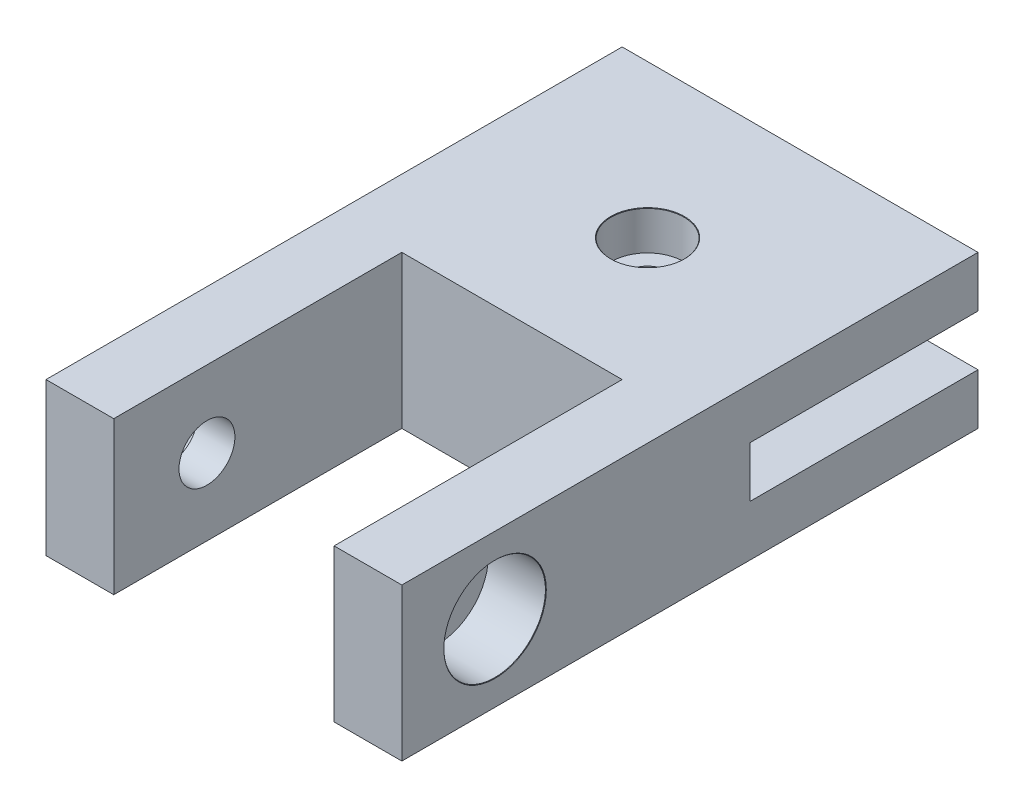
ISO-10303-21;
HEADER;
FILE_DESCRIPTION(('STEP AP214'),'2;1');
FILE_NAME('part.step','',(''),(''),'','','');
FILE_SCHEMA(('AUTOMOTIVE_DESIGN { 1 0 10303 214 1 1 1 1 }'));
ENDSEC;
DATA;
#1=APPLICATION_CONTEXT('core data for automotive mechanical design processes');
#2=APPLICATION_PROTOCOL_DEFINITION('international standard','automotive_design',2000,#1);
#3=PRODUCT_CONTEXT('',#1,'mechanical');
#4=PRODUCT('Part','Part','',(#3));
#5=PRODUCT_RELATED_PRODUCT_CATEGORY('part','',(#4));
#6=PRODUCT_DEFINITION_FORMATION('','',#4);
#7=PRODUCT_DEFINITION_CONTEXT('part definition',#1,'design');
#8=PRODUCT_DEFINITION('design','',#6,#7);
#9=PRODUCT_DEFINITION_SHAPE('','',#8);
#10=(LENGTH_UNIT() NAMED_UNIT(*) SI_UNIT(.MILLI.,.METRE.));
#11=(NAMED_UNIT(*) PLANE_ANGLE_UNIT() SI_UNIT($,.RADIAN.));
#12=(NAMED_UNIT(*) SI_UNIT($,.STERADIAN.) SOLID_ANGLE_UNIT());
#13=UNCERTAINTY_MEASURE_WITH_UNIT(LENGTH_MEASURE(1.E-05),#10,'distance_accuracy_value','');
#14=(GEOMETRIC_REPRESENTATION_CONTEXT(3) GLOBAL_UNCERTAINTY_ASSIGNED_CONTEXT((#13)) GLOBAL_UNIT_ASSIGNED_CONTEXT((#10,
#11,#12)) REPRESENTATION_CONTEXT('',''));
#15=CARTESIAN_POINT('',(0.,0.,0.));
#16=DIRECTION('',(0.,0.,1.));
#17=DIRECTION('',(1.,0.,0.));
#18=AXIS2_PLACEMENT_3D('',#15,#16,#17);
#19=CARTESIAN_POINT('',(0.,-0.00100000000000013,-8.00000000000001));
#20=DIRECTION('',(0.,1.,0.));
#21=DIRECTION('',(0.,0.,1.));
#22=AXIS2_PLACEMENT_3D('',#19,#20,#21);
#23=CYLINDRICAL_SURFACE('',#22,1.2);
#24=CARTESIAN_POINT('',(0.,3.,-8.00000000000001));
#25=DIRECTION('',(0.,1.,0.));
#26=DIRECTION('',(0.,0.,1.));
#27=AXIS2_PLACEMENT_3D('',#24,#25,#26);
#28=CIRCLE('',#27,1.2);
#29=CARTESIAN_POINT('',(0.,3.,-6.80000000000001));
#30=VERTEX_POINT('',#29);
#31=EDGE_CURVE('E278',#30,#30,#28,.T.);
#32=CARTESIAN_POINT('',(0.,1.8,-8.00000000000001));
#33=DIRECTION('',(0.,-1.,0.));
#34=DIRECTION('',(0.,0.,-1.));
#35=AXIS2_PLACEMENT_3D('',#32,#33,#34);
#36=CIRCLE('',#35,1.2);
#37=CARTESIAN_POINT('',(0.,1.8,-6.80000000000001));
#38=VERTEX_POINT('',#37);
#39=EDGE_CURVE('E46',#38,#38,#36,.F.);
#40=CARTESIAN_POINT('',(0.,3.,-6.80000000000001));
#41=CARTESIAN_POINT('',(0.,2.9875,-6.80000000000001));
#42=CARTESIAN_POINT('',(0.,2.975,-6.80000000000001));
#43=CARTESIAN_POINT('',(0.,2.95,-6.80000000000001));
#44=CARTESIAN_POINT('',(0.,2.9375,-6.80000000000001));
#45=CARTESIAN_POINT('',(0.,2.9125,-6.80000000000001));
#46=CARTESIAN_POINT('',(0.,2.9,-6.80000000000001));
#47=CARTESIAN_POINT('',(0.,2.875,-6.80000000000001));
#48=CARTESIAN_POINT('',(0.,2.8625,-6.80000000000001));
#49=CARTESIAN_POINT('',(0.,2.8375,-6.80000000000001));
#50=CARTESIAN_POINT('',(0.,2.825,-6.80000000000001));
#51=CARTESIAN_POINT('',(0.,2.8,-6.80000000000001));
#52=CARTESIAN_POINT('',(0.,2.7875,-6.80000000000001));
#53=CARTESIAN_POINT('',(0.,2.7625,-6.80000000000001));
#54=CARTESIAN_POINT('',(0.,2.75,-6.80000000000001));
#55=CARTESIAN_POINT('',(0.,2.725,-6.80000000000001));
#56=CARTESIAN_POINT('',(0.,2.7125,-6.80000000000001));
#57=CARTESIAN_POINT('',(0.,2.6875,-6.80000000000001));
#58=CARTESIAN_POINT('',(0.,2.675,-6.80000000000001));
#59=CARTESIAN_POINT('',(0.,2.65,-6.80000000000001));
#60=CARTESIAN_POINT('',(0.,2.6375,-6.80000000000001));
#61=CARTESIAN_POINT('',(0.,2.6125,-6.80000000000001));
#62=CARTESIAN_POINT('',(0.,2.6,-6.80000000000001));
#63=CARTESIAN_POINT('',(0.,2.575,-6.80000000000001));
#64=CARTESIAN_POINT('',(0.,2.5625,-6.80000000000001));
#65=CARTESIAN_POINT('',(0.,2.5375,-6.80000000000001));
#66=CARTESIAN_POINT('',(0.,2.525,-6.80000000000001));
#67=CARTESIAN_POINT('',(0.,2.5,-6.80000000000001));
#68=CARTESIAN_POINT('',(0.,2.4875,-6.80000000000001));
#69=CARTESIAN_POINT('',(0.,2.4625,-6.80000000000001));
#70=CARTESIAN_POINT('',(0.,2.45,-6.80000000000001));
#71=CARTESIAN_POINT('',(0.,2.425,-6.80000000000001));
#72=CARTESIAN_POINT('',(0.,2.4125,-6.80000000000001));
#73=CARTESIAN_POINT('',(0.,2.3875,-6.80000000000001));
#74=CARTESIAN_POINT('',(0.,2.375,-6.80000000000001));
#75=CARTESIAN_POINT('',(0.,2.35,-6.80000000000001));
#76=CARTESIAN_POINT('',(0.,2.3375,-6.80000000000001));
#77=CARTESIAN_POINT('',(0.,2.3125,-6.80000000000001));
#78=CARTESIAN_POINT('',(0.,2.3,-6.80000000000001));
#79=CARTESIAN_POINT('',(0.,2.275,-6.80000000000001));
#80=CARTESIAN_POINT('',(0.,2.2625,-6.80000000000001));
#81=CARTESIAN_POINT('',(0.,2.2375,-6.80000000000001));
#82=CARTESIAN_POINT('',(0.,2.225,-6.80000000000001));
#83=CARTESIAN_POINT('',(0.,2.2,-6.80000000000001));
#84=CARTESIAN_POINT('',(0.,2.1875,-6.80000000000001));
#85=CARTESIAN_POINT('',(0.,2.1625,-6.80000000000001));
#86=CARTESIAN_POINT('',(0.,2.15,-6.80000000000001));
#87=CARTESIAN_POINT('',(0.,2.125,-6.80000000000001));
#88=CARTESIAN_POINT('',(0.,2.1125,-6.80000000000001));
#89=CARTESIAN_POINT('',(0.,2.0875,-6.80000000000001));
#90=CARTESIAN_POINT('',(0.,2.075,-6.80000000000001));
#91=CARTESIAN_POINT('',(0.,2.05,-6.80000000000001));
#92=CARTESIAN_POINT('',(0.,2.0375,-6.80000000000001));
#93=CARTESIAN_POINT('',(0.,2.0125,-6.80000000000001));
#94=CARTESIAN_POINT('',(0.,2.,-6.80000000000001));
#95=CARTESIAN_POINT('',(0.,1.975,-6.80000000000001));
#96=CARTESIAN_POINT('',(0.,1.9625,-6.80000000000001));
#97=CARTESIAN_POINT('',(0.,1.9375,-6.80000000000001));
#98=CARTESIAN_POINT('',(0.,1.925,-6.80000000000001));
#99=CARTESIAN_POINT('',(0.,1.9,-6.80000000000001));
#100=CARTESIAN_POINT('',(0.,1.8875,-6.80000000000001));
#101=CARTESIAN_POINT('',(0.,1.8625,-6.80000000000001));
#102=CARTESIAN_POINT('',(0.,1.85,-6.80000000000001));
#103=CARTESIAN_POINT('',(0.,1.825,-6.80000000000001));
#104=CARTESIAN_POINT('',(0.,1.8125,-6.80000000000001));
#105=CARTESIAN_POINT('',(0.,1.8,-6.80000000000001));
#106=B_SPLINE_CURVE_WITH_KNOTS('',3,(#40,#41,#42,#43,#44,#45,#46,#47,#48,#49,#50,#51,#52,#53,
#54,#55,#56,#57,#58,#59,#60,#61,#62,#63,#64,#65,#66,#67,#68,#69,#70,#71,#72,#73,#74,#75,#76,#77,
#78,#79,#80,#81,#82,#83,#84,#85,#86,#87,#88,#89,#90,#91,#92,#93,#94,#95,#96,#97,#98,#99,#100,
#101,#102,#103,#104,#105),.UNSPECIFIED.,.F.,.F.,(4,2,2,2,2,2,2,2,2,2,2,2,2,2,2,2,2,2,2,2,2,2,2,
2,2,2,2,2,2,2,2,2,4),(0.,0.0375000000000002,0.075,0.1125,0.15,0.1875,0.225,0.2625,0.3,0.3375,
0.375,0.4125,0.45,0.4875,0.525,0.5625,0.6,0.6375,0.675,0.7125,0.75,0.7875,0.825,0.8625,0.9,
0.9375,0.975,1.0125,1.05,1.0875,1.125,1.1625,1.2),.UNSPECIFIED.);
#107=EDGE_CURVE('BSEAM42',#30,#38,#106,.T.);
#108=ORIENTED_EDGE('',*,*,#31,.T.);
#109=ORIENTED_EDGE('',*,*,#39,.F.);
#110=ORIENTED_EDGE('',*,*,#107,.T.);
#111=ORIENTED_EDGE('',*,*,#107,.F.);
#112=EDGE_LOOP('',(#108,#110,#109,#111));
#113=FACE_BOUND('',#112,.T.);
#114=ADVANCED_FACE('F42',(#113),#23,.F.);
#115=CARTESIAN_POINT('',(10.5,9.,-17.));
#116=DIRECTION('',(-1.,0.,0.));
#117=DIRECTION('',(0.,0.,1.));
#118=AXIS2_PLACEMENT_3D('',#115,#116,#117);
#119=PLANE('',#118);
#120=CARTESIAN_POINT('',(10.5,4.5,11.5));
#121=DIRECTION('',(1.,0.,0.));
#122=DIRECTION('',(0.,0.,-1.));
#123=AXIS2_PLACEMENT_3D('',#120,#121,#122);
#124=CIRCLE('',#123,3.025);
#125=CARTESIAN_POINT('',(10.5,4.5,8.47499999999999));
#126=VERTEX_POINT('',#125);
#127=EDGE_CURVE('E395',#126,#126,#124,.T.);
#128=ORIENTED_EDGE('',*,*,#127,.F.);
#129=EDGE_LOOP('',(#128));
#130=FACE_BOUND('',#129,.T.);
#131=DIRECTION('',(0.,0.,1.));
#132=VECTOR('',#131,1.);
#133=CARTESIAN_POINT('',(10.5,6.,-17.));
#134=LINE('',#133,#132);
#135=CARTESIAN_POINT('',(10.5,6.,-17.));
#136=VERTEX_POINT('',#135);
#137=CARTESIAN_POINT('',(10.5,6.,-3.55277781657247));
#138=VERTEX_POINT('',#137);
#139=EDGE_CURVE('E303',#136,#138,#134,.T.);
#140=ORIENTED_EDGE('',*,*,#139,.F.);
#141=DIRECTION('',(0.,-1.,0.));
#142=VECTOR('',#141,1.);
#143=CARTESIAN_POINT('',(10.5,9.,-17.));
#144=LINE('',#143,#142);
#145=CARTESIAN_POINT('',(10.5,9.,-17.));
#146=VERTEX_POINT('',#145);
#147=EDGE_CURVE('E11',#146,#136,#144,.T.);
#148=ORIENTED_EDGE('',*,*,#147,.F.);
#149=DIRECTION('',(0.,0.,-1.));
#150=VECTOR('',#149,1.);
#151=CARTESIAN_POINT('',(10.5,9.,-17.));
#152=LINE('',#151,#150);
#153=CARTESIAN_POINT('',(10.5,9.,17.));
#154=VERTEX_POINT('',#153);
#155=EDGE_CURVE('E467',#154,#146,#152,.T.);
#156=ORIENTED_EDGE('',*,*,#155,.F.);
#157=DIRECTION('',(0.,-1.,0.));
#158=VECTOR('',#157,1.);
#159=CARTESIAN_POINT('',(10.5,9.,17.));
#160=LINE('',#159,#158);
#161=CARTESIAN_POINT('',(10.5,0.,17.));
#162=VERTEX_POINT('',#161);
#163=EDGE_CURVE('E483',#154,#162,#160,.T.);
#164=ORIENTED_EDGE('',*,*,#163,.T.);
#165=DIRECTION('',(0.,0.,-1.));
#166=VECTOR('',#165,1.);
#167=CARTESIAN_POINT('',(10.5,0.,-17.));
#168=LINE('',#167,#166);
#169=CARTESIAN_POINT('',(10.5,0.,-17.));
#170=VERTEX_POINT('',#169);
#171=EDGE_CURVE('E457',#162,#170,#168,.T.);
#172=ORIENTED_EDGE('',*,*,#171,.T.);
#173=CARTESIAN_POINT('',(10.5,3.,-17.));
#174=VERTEX_POINT('',#173);
#175=EDGE_CURVE('E52',#174,#170,#144,.T.);
#176=ORIENTED_EDGE('',*,*,#175,.F.);
#177=DIRECTION('',(0.,0.,1.));
#178=VECTOR('',#177,1.);
#179=CARTESIAN_POINT('',(10.5,3.,-17.));
#180=LINE('',#179,#178);
#181=CARTESIAN_POINT('',(10.5,3.,-3.55277781657247));
#182=VERTEX_POINT('',#181);
#183=EDGE_CURVE('E302',#174,#182,#180,.T.);
#184=ORIENTED_EDGE('',*,*,#183,.T.);
#185=DIRECTION('',(0.,-1.,0.));
#186=VECTOR('',#185,1.);
#187=CARTESIAN_POINT('',(10.5,6.,-3.55277781657247));
#188=LINE('',#187,#186);
#189=EDGE_CURVE('E317',#138,#182,#188,.T.);
#190=ORIENTED_EDGE('',*,*,#189,.F.);
#191=EDGE_LOOP('',(#140,#148,#156,#164,#172,#176,#184,#190));
#192=FACE_BOUND('',#191,.T.);
#193=ADVANCED_FACE('F44',(#130,#192),#119,.F.);
#194=CARTESIAN_POINT('',(-10.5,9.,-17.));
#195=DIRECTION('',(0.,0.,1.));
#196=DIRECTION('',(1.,0.,0.));
#197=AXIS2_PLACEMENT_3D('',#194,#195,#196);
#198=PLANE('',#197);
#199=DIRECTION('',(1.,0.,0.));
#200=VECTOR('',#199,1.);
#201=CARTESIAN_POINT('',(10.5,6.,-17.));
#202=LINE('',#201,#200);
#203=CARTESIAN_POINT('',(-10.5,6.,-17.));
#204=VERTEX_POINT('',#203);
#205=EDGE_CURVE('E314',#204,#136,#202,.T.);
#206=ORIENTED_EDGE('',*,*,#205,.F.);
#207=DIRECTION('',(0.,-1.,0.));
#208=VECTOR('',#207,1.);
#209=CARTESIAN_POINT('',(-10.5,9.,-17.));
#210=LINE('',#209,#208);
#211=CARTESIAN_POINT('',(-10.5,9.,-17.));
#212=VERTEX_POINT('',#211);
#213=EDGE_CURVE('E506',#212,#204,#210,.T.);
#214=ORIENTED_EDGE('',*,*,#213,.F.);
#215=DIRECTION('',(-1.,0.,0.));
#216=VECTOR('',#215,1.);
#217=CARTESIAN_POINT('',(-10.5,9.,-17.));
#218=LINE('',#217,#216);
#219=EDGE_CURVE('E471',#146,#212,#218,.T.);
#220=ORIENTED_EDGE('',*,*,#219,.F.);
#221=ORIENTED_EDGE('',*,*,#147,.T.);
#222=EDGE_LOOP('',(#206,#214,#220,#221));
#223=FACE_BOUND('',#222,.T.);
#224=ADVANCED_FACE('F539',(#223),#198,.F.);
#225=CARTESIAN_POINT('',(-10.5,9.,-17.));
#226=DIRECTION('',(1.,0.,0.));
#227=DIRECTION('',(0.,0.,-1.));
#228=AXIS2_PLACEMENT_3D('',#225,#226,#227);
#229=PLANE('',#228);
#230=DIRECTION('',(0.,0.866025403784438,0.5));
#231=VECTOR('',#230,1.);
#232=CARTESIAN_POINT('',(-10.5,1.6,13.1743157806499));
#233=LINE('',#232,#231);
#234=CARTESIAN_POINT('',(-10.5,1.6,13.1743157806499));
#235=VERTEX_POINT('',#234);
#236=CARTESIAN_POINT('',(-10.5,4.5,14.8486315612998));
#237=VERTEX_POINT('',#236);
#238=EDGE_CURVE('E373',#235,#237,#233,.T.);
#239=ORIENTED_EDGE('',*,*,#238,.F.);
#240=DIRECTION('',(0.,0.,1.));
#241=VECTOR('',#240,1.);
#242=CARTESIAN_POINT('',(-10.5,1.6,9.82568421935008));
#243=LINE('',#242,#241);
#244=CARTESIAN_POINT('',(-10.5,1.6,9.82568421935008));
#245=VERTEX_POINT('',#244);
#246=EDGE_CURVE('E344',#245,#235,#243,.T.);
#247=ORIENTED_EDGE('',*,*,#246,.F.);
#248=DIRECTION('',(0.,-0.866025403784439,0.5));
#249=VECTOR('',#248,1.);
#250=CARTESIAN_POINT('',(-10.5,4.5,8.15136843870017));
#251=LINE('',#250,#249);
#252=CARTESIAN_POINT('',(-10.5,4.5,8.15136843870017));
#253=VERTEX_POINT('',#252);
#254=EDGE_CURVE('E350',#253,#245,#251,.T.);
#255=ORIENTED_EDGE('',*,*,#254,.F.);
#256=DIRECTION('',(0.,-0.866025403784438,-0.5));
#257=VECTOR('',#256,1.);
#258=CARTESIAN_POINT('',(-10.5,7.4,9.82568421935008));
#259=LINE('',#258,#257);
#260=CARTESIAN_POINT('',(-10.5,7.4,9.82568421935008));
#261=VERTEX_POINT('',#260);
#262=EDGE_CURVE('E385',#261,#253,#259,.T.);
#263=ORIENTED_EDGE('',*,*,#262,.F.);
#264=DIRECTION('',(0.,0.,-1.));
#265=VECTOR('',#264,1.);
#266=CARTESIAN_POINT('',(-10.5,7.4,13.1743157806499));
#267=LINE('',#266,#265);
#268=CARTESIAN_POINT('',(-10.5,7.4,13.1743157806499));
#269=VERTEX_POINT('',#268);
#270=EDGE_CURVE('E381',#269,#261,#267,.T.);
#271=ORIENTED_EDGE('',*,*,#270,.F.);
#272=DIRECTION('',(0.,0.866025403784439,-0.5));
#273=VECTOR('',#272,1.);
#274=CARTESIAN_POINT('',(-10.5,4.5,14.8486315612998));
#275=LINE('',#274,#273);
#276=EDGE_CURVE('E377',#237,#269,#275,.T.);
#277=ORIENTED_EDGE('',*,*,#276,.F.);
#278=EDGE_LOOP('',(#239,#247,#255,#263,#271,#277));
#279=FACE_BOUND('',#278,.T.);
#280=DIRECTION('',(0.,0.,-1.));
#281=VECTOR('',#280,1.);
#282=CARTESIAN_POINT('',(-10.5,6.,-17.));
#283=LINE('',#282,#281);
#284=CARTESIAN_POINT('',(-10.5,6.,-3.55277781657247));
#285=VERTEX_POINT('',#284);
#286=EDGE_CURVE('E311',#285,#204,#283,.T.);
#287=ORIENTED_EDGE('',*,*,#286,.F.);
#288=DIRECTION('',(0.,-1.,0.));
#289=VECTOR('',#288,1.);
#290=CARTESIAN_POINT('',(-10.5,6.,-3.55277781657247));
#291=LINE('',#290,#289);
#292=CARTESIAN_POINT('',(-10.5,3.,-3.55277781657247));
#293=VERTEX_POINT('',#292);
#294=EDGE_CURVE('E330',#285,#293,#291,.T.);
#295=ORIENTED_EDGE('',*,*,#294,.T.);
#296=DIRECTION('',(0.,0.,-1.));
#297=VECTOR('',#296,1.);
#298=CARTESIAN_POINT('',(-10.5,3.,-17.));
#299=LINE('',#298,#297);
#300=CARTESIAN_POINT('',(-10.5,3.,-17.));
#301=VERTEX_POINT('',#300);
#302=EDGE_CURVE('E325',#293,#301,#299,.T.);
#303=ORIENTED_EDGE('',*,*,#302,.T.);
#304=CARTESIAN_POINT('',(-10.5,0.,-17.));
#305=VERTEX_POINT('',#304);
#306=EDGE_CURVE('E505',#301,#305,#210,.T.);
#307=ORIENTED_EDGE('',*,*,#306,.T.);
#308=DIRECTION('',(0.,0.,1.));
#309=VECTOR('',#308,1.);
#310=CARTESIAN_POINT('',(-10.5,0.,-17.));
#311=LINE('',#310,#309);
#312=CARTESIAN_POINT('',(-10.5,0.,17.));
#313=VERTEX_POINT('',#312);
#314=EDGE_CURVE('E491',#305,#313,#311,.T.);
#315=ORIENTED_EDGE('',*,*,#314,.T.);
#316=DIRECTION('',(0.,-1.,0.));
#317=VECTOR('',#316,1.);
#318=CARTESIAN_POINT('',(-10.5,9.,17.));
#319=LINE('',#318,#317);
#320=CARTESIAN_POINT('',(-10.5,9.,17.));
#321=VERTEX_POINT('',#320);
#322=EDGE_CURVE('E501',#321,#313,#319,.T.);
#323=ORIENTED_EDGE('',*,*,#322,.F.);
#324=DIRECTION('',(0.,0.,1.));
#325=VECTOR('',#324,1.);
#326=CARTESIAN_POINT('',(-10.5,9.,-17.));
#327=LINE('',#326,#325);
#328=EDGE_CURVE('E475',#212,#321,#327,.T.);
#329=ORIENTED_EDGE('',*,*,#328,.F.);
#330=ORIENTED_EDGE('',*,*,#213,.T.);
#331=EDGE_LOOP('',(#287,#295,#303,#307,#315,#323,#329,#330));
#332=FACE_BOUND('',#331,.T.);
#333=ADVANCED_FACE('F516',(#279,#332),#229,.F.);
#334=CARTESIAN_POINT('',(-10.5,9.,17.));
#335=DIRECTION('',(0.,0.,-1.));
#336=DIRECTION('',(-1.,0.,0.));
#337=AXIS2_PLACEMENT_3D('',#334,#335,#336);
#338=PLANE('',#337);
#339=DIRECTION('',(1.,0.,0.));
#340=VECTOR('',#339,1.);
#341=CARTESIAN_POINT('',(-10.5,9.,17.));
#342=LINE('',#341,#340);
#343=CARTESIAN_POINT('',(6.50184802096263,9.,17.));
#344=VERTEX_POINT('',#343);
#345=EDGE_CURVE('E478',#344,#154,#342,.T.);
#346=ORIENTED_EDGE('',*,*,#345,.F.);
#347=DIRECTION('',(0.,1.,0.));
#348=VECTOR('',#347,1.);
#349=CARTESIAN_POINT('',(6.50184802096263,0.,17.));
#350=LINE('',#349,#348);
#351=CARTESIAN_POINT('',(6.50184802096263,0.,17.));
#352=VERTEX_POINT('',#351);
#353=EDGE_CURVE('E454',#352,#344,#350,.T.);
#354=ORIENTED_EDGE('',*,*,#353,.F.);
#355=DIRECTION('',(1.,0.,0.));
#356=VECTOR('',#355,1.);
#357=CARTESIAN_POINT('',(-10.5,0.,17.));
#358=LINE('',#357,#356);
#359=EDGE_CURVE('E494',#352,#162,#358,.T.);
#360=ORIENTED_EDGE('',*,*,#359,.T.);
#361=ORIENTED_EDGE('',*,*,#163,.F.);
#362=EDGE_LOOP('',(#346,#354,#360,#361));
#363=FACE_BOUND('',#362,.T.);
#364=ADVANCED_FACE('F660',(#363),#338,.F.);
#365=ORIENTED_EDGE('',*,*,#306,.F.);
#366=DIRECTION('',(1.,0.,0.));
#367=VECTOR('',#366,1.);
#368=CARTESIAN_POINT('',(10.5,3.,-17.));
#369=LINE('',#368,#367);
#370=EDGE_CURVE('E67',#301,#174,#369,.T.);
#371=ORIENTED_EDGE('',*,*,#370,.T.);
#372=ORIENTED_EDGE('',*,*,#175,.T.);
#373=DIRECTION('',(-1.,0.,0.));
#374=VECTOR('',#373,1.);
#375=CARTESIAN_POINT('',(-10.5,0.,-17.));
#376=LINE('',#375,#374);
#377=EDGE_CURVE('E487',#170,#305,#376,.T.);
#378=ORIENTED_EDGE('',*,*,#377,.T.);
#379=EDGE_LOOP('',(#365,#371,#372,#378));
#380=FACE_BOUND('',#379,.T.);
#381=ADVANCED_FACE('F521',(#380),#198,.F.);
#382=CARTESIAN_POINT('',(-6.50184802096263,0.,17.));
#383=VERTEX_POINT('',#382);
#384=EDGE_CURVE('E472',#313,#383,#358,.T.);
#385=ORIENTED_EDGE('',*,*,#384,.T.);
#386=DIRECTION('',(0.,1.,0.));
#387=VECTOR('',#386,1.);
#388=CARTESIAN_POINT('',(-6.50184802096263,0.,17.));
#389=LINE('',#388,#387);
#390=CARTESIAN_POINT('',(-6.50184802096263,9.,17.));
#391=VERTEX_POINT('',#390);
#392=EDGE_CURVE('E458',#383,#391,#389,.T.);
#393=ORIENTED_EDGE('',*,*,#392,.T.);
#394=EDGE_CURVE('E479',#321,#391,#342,.T.);
#395=ORIENTED_EDGE('',*,*,#394,.F.);
#396=ORIENTED_EDGE('',*,*,#322,.T.);
#397=EDGE_LOOP('',(#385,#393,#395,#396));
#398=FACE_BOUND('',#397,.T.);
#399=ADVANCED_FACE('F529',(#398),#338,.F.);
#400=CARTESIAN_POINT('',(0.,9.,0.));
#401=DIRECTION('',(0.,1.,0.));
#402=DIRECTION('',(0.,0.,1.));
#403=AXIS2_PLACEMENT_3D('',#400,#401,#402);
#404=PLANE('',#403);
#405=CARTESIAN_POINT('',(0.,9.,-8.00000000000001));
#406=DIRECTION('',(0.,1.,0.));
#407=DIRECTION('',(0.,0.,1.));
#408=AXIS2_PLACEMENT_3D('',#405,#406,#407);
#409=CIRCLE('',#408,2.175);
#410=CARTESIAN_POINT('',(0.,9.,-5.82500000000001));
#411=VERTEX_POINT('',#410);
#412=EDGE_CURVE('E282',#411,#411,#409,.T.);
#413=ORIENTED_EDGE('',*,*,#412,.F.);
#414=EDGE_LOOP('',(#413));
#415=FACE_BOUND('',#414,.T.);
#416=DIRECTION('',(0.,0.,-1.));
#417=VECTOR('',#416,1.);
#418=CARTESIAN_POINT('',(6.50184802096263,9.,0.));
#419=LINE('',#418,#417);
#420=CARTESIAN_POINT('',(6.50184802096263,9.,0.));
#421=VERTEX_POINT('',#420);
#422=EDGE_CURVE('E430',#344,#421,#419,.T.);
#423=ORIENTED_EDGE('',*,*,#422,.F.);
#424=ORIENTED_EDGE('',*,*,#345,.T.);
#425=ORIENTED_EDGE('',*,*,#155,.T.);
#426=ORIENTED_EDGE('',*,*,#219,.T.);
#427=ORIENTED_EDGE('',*,*,#328,.T.);
#428=ORIENTED_EDGE('',*,*,#394,.T.);
#429=DIRECTION('',(0.,0.,1.));
#430=VECTOR('',#429,1.);
#431=CARTESIAN_POINT('',(-6.50184802096263,9.,0.));
#432=LINE('',#431,#430);
#433=CARTESIAN_POINT('',(-6.50184802096263,9.,0.));
#434=VERTEX_POINT('',#433);
#435=EDGE_CURVE('E436',#434,#391,#432,.T.);
#436=ORIENTED_EDGE('',*,*,#435,.F.);
#437=DIRECTION('',(-1.,0.,0.));
#438=VECTOR('',#437,1.);
#439=CARTESIAN_POINT('',(6.50184802096263,9.,0.));
#440=LINE('',#439,#438);
#441=EDGE_CURVE('E448',#421,#434,#440,.T.);
#442=ORIENTED_EDGE('',*,*,#441,.F.);
#443=EDGE_LOOP('',(#423,#424,#425,#426,#427,#428,#436,#442));
#444=FACE_BOUND('',#443,.T.);
#445=ADVANCED_FACE('F533',(#415,#444),#404,.T.);
#446=CARTESIAN_POINT('',(0.,0.,0.));
#447=DIRECTION('',(0.,1.,0.));
#448=DIRECTION('',(0.,0.,1.));
#449=AXIS2_PLACEMENT_3D('',#446,#447,#448);
#450=PLANE('',#449);
#451=DIRECTION('',(0.5,0.,0.866025403784438));
#452=VECTOR('',#451,1.);
#453=CARTESIAN_POINT('',(1.21243556529823,0.,-10.1));
#454=LINE('',#453,#452);
#455=CARTESIAN_POINT('',(1.21243556529823,0.,-10.1));
#456=VERTEX_POINT('',#455);
#457=CARTESIAN_POINT('',(2.42487113059644,0.,-8.00000000000001));
#458=VERTEX_POINT('',#457);
#459=EDGE_CURVE('E250',#456,#458,#454,.T.);
#460=ORIENTED_EDGE('',*,*,#459,.F.);
#461=DIRECTION('',(1.,0.,0.));
#462=VECTOR('',#461,1.);
#463=CARTESIAN_POINT('',(-1.21243556529821,0.,-10.1));
#464=LINE('',#463,#462);
#465=CARTESIAN_POINT('',(-1.21243556529821,0.,-10.1));
#466=VERTEX_POINT('',#465);
#467=EDGE_CURVE('E59',#466,#456,#464,.T.);
#468=ORIENTED_EDGE('',*,*,#467,.F.);
#469=DIRECTION('',(0.5,0.,-0.866025403784439));
#470=VECTOR('',#469,1.);
#471=CARTESIAN_POINT('',(-2.42487113059642,0.,-8.00000000000001));
#472=LINE('',#471,#470);
#473=CARTESIAN_POINT('',(-2.42487113059642,0.,-8.00000000000001));
#474=VERTEX_POINT('',#473);
#475=EDGE_CURVE('E230',#474,#466,#472,.T.);
#476=ORIENTED_EDGE('',*,*,#475,.F.);
#477=DIRECTION('',(-0.5,0.,-0.866025403784439));
#478=VECTOR('',#477,1.);
#479=CARTESIAN_POINT('',(-1.21243556529821,0.,-5.90000000000001));
#480=LINE('',#479,#478);
#481=CARTESIAN_POINT('',(-1.21243556529821,0.,-5.90000000000001));
#482=VERTEX_POINT('',#481);
#483=EDGE_CURVE('E234',#482,#474,#480,.T.);
#484=ORIENTED_EDGE('',*,*,#483,.F.);
#485=DIRECTION('',(-1.,0.,0.));
#486=VECTOR('',#485,1.);
#487=CARTESIAN_POINT('',(1.21243556529823,0.,-5.90000000000001));
#488=LINE('',#487,#486);
#489=CARTESIAN_POINT('',(1.21243556529823,0.,-5.90000000000001));
#490=VERTEX_POINT('',#489);
#491=EDGE_CURVE('E257',#490,#482,#488,.T.);
#492=ORIENTED_EDGE('',*,*,#491,.F.);
#493=DIRECTION('',(-0.5,0.,0.866025403784438));
#494=VECTOR('',#493,1.);
#495=CARTESIAN_POINT('',(2.42487113059644,0.,-8.00000000000001));
#496=LINE('',#495,#494);
#497=EDGE_CURVE('E253',#458,#490,#496,.T.);
#498=ORIENTED_EDGE('',*,*,#497,.F.);
#499=EDGE_LOOP('',(#460,#468,#476,#484,#492,#498));
#500=FACE_BOUND('',#499,.T.);
#501=ORIENTED_EDGE('',*,*,#359,.F.);
#502=DIRECTION('',(0.,0.,-1.));
#503=VECTOR('',#502,1.);
#504=CARTESIAN_POINT('',(6.50184802096263,0.,0.));
#505=LINE('',#504,#503);
#506=CARTESIAN_POINT('',(6.50184802096263,0.,0.));
#507=VERTEX_POINT('',#506);
#508=EDGE_CURVE('E431',#352,#507,#505,.T.);
#509=ORIENTED_EDGE('',*,*,#508,.T.);
#510=DIRECTION('',(-1.,0.,0.));
#511=VECTOR('',#510,1.);
#512=CARTESIAN_POINT('',(6.50184802096263,0.,0.));
#513=LINE('',#512,#511);
#514=CARTESIAN_POINT('',(-6.50184802096263,0.,0.));
#515=VERTEX_POINT('',#514);
#516=EDGE_CURVE('E435',#507,#515,#513,.T.);
#517=ORIENTED_EDGE('',*,*,#516,.T.);
#518=DIRECTION('',(0.,0.,1.));
#519=VECTOR('',#518,1.);
#520=CARTESIAN_POINT('',(-6.50184802096263,0.,0.));
#521=LINE('',#520,#519);
#522=EDGE_CURVE('E440',#515,#383,#521,.T.);
#523=ORIENTED_EDGE('',*,*,#522,.T.);
#524=ORIENTED_EDGE('',*,*,#384,.F.);
#525=ORIENTED_EDGE('',*,*,#314,.F.);
#526=ORIENTED_EDGE('',*,*,#377,.F.);
#527=ORIENTED_EDGE('',*,*,#171,.F.);
#528=EDGE_LOOP('',(#501,#509,#517,#523,#524,#525,#526,#527));
#529=FACE_BOUND('',#528,.T.);
#530=ADVANCED_FACE('F527',(#500,#529),#450,.F.);
#531=CARTESIAN_POINT('',(6.50184802096263,0.,0.));
#532=DIRECTION('',(1.,0.,0.));
#533=DIRECTION('',(0.,0.,-1.));
#534=AXIS2_PLACEMENT_3D('',#531,#532,#533);
#535=PLANE('',#534);
#536=CARTESIAN_POINT('',(6.50184802096263,4.5,11.5));
#537=DIRECTION('',(1.,0.,0.));
#538=DIRECTION('',(0.,0.,-1.));
#539=AXIS2_PLACEMENT_3D('',#536,#537,#538);
#540=CIRCLE('',#539,1.7);
#541=CARTESIAN_POINT('',(6.50184802096263,4.5,9.79999999999999));
#542=VERTEX_POINT('',#541);
#543=EDGE_CURVE('E426',#542,#542,#540,.T.);
#544=ORIENTED_EDGE('',*,*,#543,.T.);
#545=EDGE_LOOP('',(#544));
#546=FACE_BOUND('',#545,.T.);
#547=ORIENTED_EDGE('',*,*,#422,.T.);
#548=DIRECTION('',(0.,1.,0.));
#549=VECTOR('',#548,1.);
#550=CARTESIAN_POINT('',(6.50184802096263,0.,0.));
#551=LINE('',#550,#549);
#552=EDGE_CURVE('E444',#507,#421,#551,.T.);
#553=ORIENTED_EDGE('',*,*,#552,.F.);
#554=ORIENTED_EDGE('',*,*,#508,.F.);
#555=ORIENTED_EDGE('',*,*,#353,.T.);
#556=EDGE_LOOP('',(#547,#553,#554,#555));
#557=FACE_BOUND('',#556,.T.);
#558=ADVANCED_FACE('F645',(#546,#557),#535,.F.);
#559=CARTESIAN_POINT('',(-6.50184802096263,0.,0.));
#560=DIRECTION('',(-1.,0.,0.));
#561=DIRECTION('',(0.,0.,1.));
#562=AXIS2_PLACEMENT_3D('',#559,#560,#561);
#563=PLANE('',#562);
#564=CARTESIAN_POINT('',(-6.50184802096263,4.5,11.5));
#565=DIRECTION('',(-1.,0.,0.));
#566=DIRECTION('',(0.,0.,1.));
#567=AXIS2_PLACEMENT_3D('',#564,#565,#566);
#568=CIRCLE('',#567,1.65);
#569=CARTESIAN_POINT('',(-6.50184802096263,4.5,13.15));
#570=VERTEX_POINT('',#569);
#571=EDGE_CURVE('E340',#570,#570,#568,.F.);
#572=ORIENTED_EDGE('',*,*,#571,.F.);
#573=EDGE_LOOP('',(#572));
#574=FACE_BOUND('',#573,.T.);
#575=ORIENTED_EDGE('',*,*,#435,.T.);
#576=ORIENTED_EDGE('',*,*,#392,.F.);
#577=ORIENTED_EDGE('',*,*,#522,.F.);
#578=DIRECTION('',(0.,1.,0.));
#579=VECTOR('',#578,1.);
#580=CARTESIAN_POINT('',(-6.50184802096263,0.,0.));
#581=LINE('',#580,#579);
#582=EDGE_CURVE('E462',#515,#434,#581,.T.);
#583=ORIENTED_EDGE('',*,*,#582,.T.);
#584=EDGE_LOOP('',(#575,#576,#577,#583));
#585=FACE_BOUND('',#584,.T.);
#586=ADVANCED_FACE('F642',(#574,#585),#563,.F.);
#587=CARTESIAN_POINT('',(6.50184802096263,0.,0.));
#588=DIRECTION('',(0.,0.,-1.));
#589=DIRECTION('',(-1.,0.,0.));
#590=AXIS2_PLACEMENT_3D('',#587,#588,#589);
#591=PLANE('',#590);
#592=ORIENTED_EDGE('',*,*,#441,.T.);
#593=ORIENTED_EDGE('',*,*,#582,.F.);
#594=ORIENTED_EDGE('',*,*,#516,.F.);
#595=ORIENTED_EDGE('',*,*,#552,.T.);
#596=EDGE_LOOP('',(#592,#593,#594,#595));
#597=FACE_BOUND('',#596,.T.);
#598=ADVANCED_FACE('F640',(#597),#591,.F.);
#599=CARTESIAN_POINT('',(10.5,4.5,11.5));
#600=DIRECTION('',(1.,0.,0.));
#601=DIRECTION('',(0.,0.,-1.));
#602=AXIS2_PLACEMENT_3D('',#599,#600,#601);
#603=CYLINDRICAL_SURFACE('',#602,1.7);
#604=ORIENTED_EDGE('',*,*,#543,.F.);
#605=EDGE_LOOP('',(#604));
#606=FACE_BOUND('',#605,.T.);
#607=CARTESIAN_POINT('',(7.1,4.5,11.5));
#608=DIRECTION('',(1.,0.,0.));
#609=DIRECTION('',(0.,0.,-1.));
#610=AXIS2_PLACEMENT_3D('',#607,#608,#609);
#611=CIRCLE('',#610,1.7);
#612=CARTESIAN_POINT('',(7.1,4.5,9.79999999999999));
#613=VERTEX_POINT('',#612);
#614=EDGE_CURVE('E422',#613,#613,#611,.T.);
#615=ORIENTED_EDGE('',*,*,#614,.T.);
#616=EDGE_LOOP('',(#615));
#617=FACE_BOUND('',#616,.T.);
#618=ADVANCED_FACE('F636',(#606,#617),#603,.F.);
#619=CARTESIAN_POINT('',(7.1,7.5,11.5));
#620=DIRECTION('',(-1.,0.,0.));
#621=DIRECTION('',(0.,0.,1.));
#622=AXIS2_PLACEMENT_3D('',#619,#620,#621);
#623=PLANE('',#622);
#624=ORIENTED_EDGE('',*,*,#614,.F.);
#625=EDGE_LOOP('',(#624));
#626=FACE_BOUND('',#625,.T.);
#627=CARTESIAN_POINT('',(7.1,4.5,11.5));
#628=DIRECTION('',(1.,0.,0.));
#629=DIRECTION('',(0.,0.,-1.));
#630=AXIS2_PLACEMENT_3D('',#627,#628,#629);
#631=CIRCLE('',#630,3.);
#632=CARTESIAN_POINT('',(7.1,4.5,8.49999999999999));
#633=VERTEX_POINT('',#632);
#634=EDGE_CURVE('E418',#633,#633,#631,.T.);
#635=ORIENTED_EDGE('',*,*,#634,.T.);
#636=EDGE_LOOP('',(#635));
#637=FACE_BOUND('',#636,.T.);
#638=ADVANCED_FACE('F632',(#626,#637),#623,.F.);
#639=CARTESIAN_POINT('',(10.5,4.5,11.5));
#640=DIRECTION('',(1.,0.,0.));
#641=DIRECTION('',(0.,0.,-1.));
#642=AXIS2_PLACEMENT_3D('',#639,#640,#641);
#643=CYLINDRICAL_SURFACE('',#642,3.);
#644=ORIENTED_EDGE('',*,*,#634,.F.);
#645=EDGE_LOOP('',(#644));
#646=FACE_BOUND('',#645,.T.);
#647=CARTESIAN_POINT('',(10.475,4.5,11.5));
#648=DIRECTION('',(1.,0.,0.));
#649=DIRECTION('',(0.,0.,-1.));
#650=AXIS2_PLACEMENT_3D('',#647,#648,#649);
#651=CIRCLE('',#650,3.);
#652=CARTESIAN_POINT('',(10.475,4.5,8.49999999999999));
#653=VERTEX_POINT('',#652);
#654=EDGE_CURVE('E414',#653,#653,#651,.T.);
#655=ORIENTED_EDGE('',*,*,#654,.T.);
#656=EDGE_LOOP('',(#655));
#657=FACE_BOUND('',#656,.T.);
#658=ADVANCED_FACE('F628',(#646,#657),#643,.F.);
#659=CARTESIAN_POINT('',(10.5,4.5,11.5));
#660=DIRECTION('',(1.,0.,0.));
#661=DIRECTION('',(0.,0.,-1.));
#662=AXIS2_PLACEMENT_3D('',#659,#660,#661);
#663=CONICAL_SURFACE('',#662,3.025,0.785398163397448);
#664=ORIENTED_EDGE('',*,*,#654,.F.);
#665=EDGE_LOOP('',(#664));
#666=FACE_BOUND('',#665,.T.);
#667=ORIENTED_EDGE('',*,*,#127,.T.);
#668=EDGE_LOOP('',(#667));
#669=FACE_BOUND('',#668,.T.);
#670=ADVANCED_FACE('F624',(#666,#669),#663,.F.);
#671=CARTESIAN_POINT('',(-8.7,1.6,9.82568421935008));
#672=DIRECTION('',(0.,-1.,0.));
#673=DIRECTION('',(0.,0.,-1.));
#674=AXIS2_PLACEMENT_3D('',#671,#672,#673);
#675=PLANE('',#674);
#676=ORIENTED_EDGE('',*,*,#246,.T.);
#677=DIRECTION('',(-1.,0.,0.));
#678=VECTOR('',#677,1.);
#679=CARTESIAN_POINT('',(-8.7,1.6,13.1743157806499));
#680=LINE('',#679,#678);
#681=CARTESIAN_POINT('',(-8.7,1.6,13.1743157806499));
#682=VERTEX_POINT('',#681);
#683=EDGE_CURVE('E370',#682,#235,#680,.T.);
#684=ORIENTED_EDGE('',*,*,#683,.F.);
#685=DIRECTION('',(0.,0.,1.));
#686=VECTOR('',#685,1.);
#687=CARTESIAN_POINT('',(-8.7,1.6,9.82568421935008));
#688=LINE('',#687,#686);
#689=CARTESIAN_POINT('',(-8.7,1.6,9.82568421935008));
#690=VERTEX_POINT('',#689);
#691=EDGE_CURVE('E345',#690,#682,#688,.T.);
#692=ORIENTED_EDGE('',*,*,#691,.F.);
#693=DIRECTION('',(-1.,0.,0.));
#694=VECTOR('',#693,1.);
#695=CARTESIAN_POINT('',(-8.7,1.6,9.82568421935008));
#696=LINE('',#695,#694);
#697=EDGE_CURVE('E392',#690,#245,#696,.T.);
#698=ORIENTED_EDGE('',*,*,#697,.T.);
#699=EDGE_LOOP('',(#676,#684,#692,#698));
#700=FACE_BOUND('',#699,.T.);
#701=ADVANCED_FACE('F606',(#700),#675,.F.);
#702=CARTESIAN_POINT('',(-8.7,4.5,8.15136843870017));
#703=DIRECTION('',(0.,-0.5,-0.866025403784439));
#704=DIRECTION('',(0.,0.866025403784439,-0.5));
#705=AXIS2_PLACEMENT_3D('',#702,#703,#704);
#706=PLANE('',#705);
#707=ORIENTED_EDGE('',*,*,#254,.T.);
#708=ORIENTED_EDGE('',*,*,#697,.F.);
#709=DIRECTION('',(0.,-0.866025403784439,0.5));
#710=VECTOR('',#709,1.);
#711=CARTESIAN_POINT('',(-8.7,4.5,8.15136843870017));
#712=LINE('',#711,#710);
#713=CARTESIAN_POINT('',(-8.7,4.5,8.15136843870017));
#714=VERTEX_POINT('',#713);
#715=EDGE_CURVE('E366',#714,#690,#712,.T.);
#716=ORIENTED_EDGE('',*,*,#715,.F.);
#717=DIRECTION('',(-1.,0.,0.));
#718=VECTOR('',#717,1.);
#719=CARTESIAN_POINT('',(-8.7,4.5,8.15136843870017));
#720=LINE('',#719,#718);
#721=EDGE_CURVE('E396',#714,#253,#720,.T.);
#722=ORIENTED_EDGE('',*,*,#721,.T.);
#723=EDGE_LOOP('',(#707,#708,#716,#722));
#724=FACE_BOUND('',#723,.T.);
#725=ADVANCED_FACE('F602',(#724),#706,.F.);
#726=CARTESIAN_POINT('',(-8.7,7.4,9.82568421935008));
#727=DIRECTION('',(0.,0.5,-0.866025403784438));
#728=DIRECTION('',(0.,0.866025403784439,0.5));
#729=AXIS2_PLACEMENT_3D('',#726,#727,#728);
#730=PLANE('',#729);
#731=ORIENTED_EDGE('',*,*,#262,.T.);
#732=ORIENTED_EDGE('',*,*,#721,.F.);
#733=DIRECTION('',(0.,-0.866025403784438,-0.5));
#734=VECTOR('',#733,1.);
#735=CARTESIAN_POINT('',(-8.7,7.4,9.82568421935008));
#736=LINE('',#735,#734);
#737=CARTESIAN_POINT('',(-8.7,7.4,9.82568421935008));
#738=VERTEX_POINT('',#737);
#739=EDGE_CURVE('E362',#738,#714,#736,.T.);
#740=ORIENTED_EDGE('',*,*,#739,.F.);
#741=DIRECTION('',(-1.,0.,0.));
#742=VECTOR('',#741,1.);
#743=CARTESIAN_POINT('',(-8.7,7.4,9.82568421935008));
#744=LINE('',#743,#742);
#745=EDGE_CURVE('E399',#738,#261,#744,.T.);
#746=ORIENTED_EDGE('',*,*,#745,.T.);
#747=EDGE_LOOP('',(#731,#732,#740,#746));
#748=FACE_BOUND('',#747,.T.);
#749=ADVANCED_FACE('F605',(#748),#730,.F.);
#750=CARTESIAN_POINT('',(-8.7,7.4,13.1743157806499));
#751=DIRECTION('',(0.,1.,0.));
#752=DIRECTION('',(0.,0.,1.));
#753=AXIS2_PLACEMENT_3D('',#750,#751,#752);
#754=PLANE('',#753);
#755=ORIENTED_EDGE('',*,*,#270,.T.);
#756=ORIENTED_EDGE('',*,*,#745,.F.);
#757=DIRECTION('',(0.,0.,-1.));
#758=VECTOR('',#757,1.);
#759=CARTESIAN_POINT('',(-8.7,7.4,13.1743157806499));
#760=LINE('',#759,#758);
#761=CARTESIAN_POINT('',(-8.7,7.4,13.1743157806499));
#762=VERTEX_POINT('',#761);
#763=EDGE_CURVE('E358',#762,#738,#760,.T.);
#764=ORIENTED_EDGE('',*,*,#763,.F.);
#765=DIRECTION('',(-1.,0.,0.));
#766=VECTOR('',#765,1.);
#767=CARTESIAN_POINT('',(-8.7,7.4,13.1743157806499));
#768=LINE('',#767,#766);
#769=EDGE_CURVE('E402',#762,#269,#768,.T.);
#770=ORIENTED_EDGE('',*,*,#769,.T.);
#771=EDGE_LOOP('',(#755,#756,#764,#770));
#772=FACE_BOUND('',#771,.T.);
#773=ADVANCED_FACE('F610',(#772),#754,.F.);
#774=CARTESIAN_POINT('',(-8.7,4.5,14.8486315612998));
#775=DIRECTION('',(0.,0.5,0.866025403784439));
#776=DIRECTION('',(0.,-0.866025403784439,0.5));
#777=AXIS2_PLACEMENT_3D('',#774,#775,#776);
#778=PLANE('',#777);
#779=ORIENTED_EDGE('',*,*,#276,.T.);
#780=ORIENTED_EDGE('',*,*,#769,.F.);
#781=DIRECTION('',(0.,0.866025403784439,-0.5));
#782=VECTOR('',#781,1.);
#783=CARTESIAN_POINT('',(-8.7,4.5,14.8486315612998));
#784=LINE('',#783,#782);
#785=CARTESIAN_POINT('',(-8.7,4.5,14.8486315612998));
#786=VERTEX_POINT('',#785);
#787=EDGE_CURVE('E354',#786,#762,#784,.T.);
#788=ORIENTED_EDGE('',*,*,#787,.F.);
#789=DIRECTION('',(-1.,0.,0.));
#790=VECTOR('',#789,1.);
#791=CARTESIAN_POINT('',(-8.7,4.5,14.8486315612998));
#792=LINE('',#791,#790);
#793=EDGE_CURVE('E405',#786,#237,#792,.T.);
#794=ORIENTED_EDGE('',*,*,#793,.T.);
#795=EDGE_LOOP('',(#779,#780,#788,#794));
#796=FACE_BOUND('',#795,.T.);
#797=ADVANCED_FACE('F614',(#796),#778,.F.);
#798=CARTESIAN_POINT('',(-8.7,1.6,13.1743157806499));
#799=DIRECTION('',(0.,-0.5,0.866025403784438));
#800=DIRECTION('',(0.,-0.866025403784439,-0.5));
#801=AXIS2_PLACEMENT_3D('',#798,#799,#800);
#802=PLANE('',#801);
#803=ORIENTED_EDGE('',*,*,#238,.T.);
#804=ORIENTED_EDGE('',*,*,#793,.F.);
#805=DIRECTION('',(0.,0.866025403784438,0.5));
#806=VECTOR('',#805,1.);
#807=CARTESIAN_POINT('',(-8.7,1.6,13.1743157806499));
#808=LINE('',#807,#806);
#809=EDGE_CURVE('E349',#682,#786,#808,.T.);
#810=ORIENTED_EDGE('',*,*,#809,.F.);
#811=ORIENTED_EDGE('',*,*,#683,.T.);
#812=EDGE_LOOP('',(#803,#804,#810,#811));
#813=FACE_BOUND('',#812,.T.);
#814=ADVANCED_FACE('F600',(#813),#802,.F.);
#815=CARTESIAN_POINT('',(-8.7,0.,0.));
#816=DIRECTION('',(-1.,0.,0.));
#817=DIRECTION('',(0.,0.,1.));
#818=AXIS2_PLACEMENT_3D('',#815,#816,#817);
#819=PLANE('',#818);
#820=CARTESIAN_POINT('',(-8.7,4.5,11.5));
#821=DIRECTION('',(-1.,0.,0.));
#822=DIRECTION('',(0.,0.,1.));
#823=AXIS2_PLACEMENT_3D('',#820,#821,#822);
#824=CIRCLE('',#823,1.65);
#825=CARTESIAN_POINT('',(-8.7,4.5,13.15));
#826=VERTEX_POINT('',#825);
#827=EDGE_CURVE('E334',#826,#826,#824,.T.);
#828=ORIENTED_EDGE('',*,*,#827,.F.);
#829=EDGE_LOOP('',(#828));
#830=FACE_BOUND('',#829,.T.);
#831=ORIENTED_EDGE('',*,*,#691,.T.);
#832=ORIENTED_EDGE('',*,*,#809,.T.);
#833=ORIENTED_EDGE('',*,*,#787,.T.);
#834=ORIENTED_EDGE('',*,*,#763,.T.);
#835=ORIENTED_EDGE('',*,*,#739,.T.);
#836=ORIENTED_EDGE('',*,*,#715,.T.);
#837=EDGE_LOOP('',(#831,#832,#833,#834,#835,#836));
#838=FACE_BOUND('',#837,.T.);
#839=ADVANCED_FACE('F596',(#830,#838),#819,.T.);
#840=CARTESIAN_POINT('',(10.501,4.5,11.5));
#841=DIRECTION('',(-1.,0.,0.));
#842=DIRECTION('',(0.,0.,1.));
#843=AXIS2_PLACEMENT_3D('',#840,#841,#842);
#844=CYLINDRICAL_SURFACE('',#843,1.65);
#845=ORIENTED_EDGE('',*,*,#827,.T.);
#846=EDGE_LOOP('',(#845));
#847=FACE_BOUND('',#846,.T.);
#848=ORIENTED_EDGE('',*,*,#571,.T.);
#849=EDGE_LOOP('',(#848));
#850=FACE_BOUND('',#849,.T.);
#851=ADVANCED_FACE('F593',(#847,#850),#844,.F.);
#852=CARTESIAN_POINT('',(0.,6.,-103.));
#853=DIRECTION('',(0.,-1.,0.));
#854=DIRECTION('',(0.,0.,-1.));
#855=AXIS2_PLACEMENT_3D('',#852,#853,#854);
#856=CYLINDRICAL_SURFACE('',#855,100.);
#857=CARTESIAN_POINT('',(0.,3.,-103.));
#858=DIRECTION('',(0.,-1.,0.));
#859=DIRECTION('',(0.,0.,-1.));
#860=AXIS2_PLACEMENT_3D('',#857,#858,#859);
#861=CIRCLE('',#860,100.);
#862=EDGE_CURVE('E321',#182,#293,#861,.T.);
#863=ORIENTED_EDGE('',*,*,#862,.T.);
#864=ORIENTED_EDGE('',*,*,#294,.F.);
#865=CARTESIAN_POINT('',(0.,6.,-103.));
#866=DIRECTION('',(0.,-1.,0.));
#867=DIRECTION('',(0.,0.,-1.));
#868=AXIS2_PLACEMENT_3D('',#865,#866,#867);
#869=CIRCLE('',#868,100.);
#870=EDGE_CURVE('E307',#138,#285,#869,.T.);
#871=ORIENTED_EDGE('',*,*,#870,.F.);
#872=ORIENTED_EDGE('',*,*,#189,.T.);
#873=EDGE_LOOP('',(#863,#864,#871,#872));
#874=FACE_BOUND('',#873,.T.);
#875=ADVANCED_FACE('F547',(#874),#856,.F.);
#876=CARTESIAN_POINT('',(0.,6.,-103.));
#877=DIRECTION('',(0.,-1.,0.));
#878=DIRECTION('',(0.,0.,-1.));
#879=AXIS2_PLACEMENT_3D('',#876,#877,#878);
#880=PLANE('',#879);
#881=CARTESIAN_POINT('',(0.,6.,-8.00000000000001));
#882=DIRECTION('',(0.,-1.,0.));
#883=DIRECTION('',(0.,0.,-1.));
#884=AXIS2_PLACEMENT_3D('',#881,#882,#883);
#885=CIRCLE('',#884,1.2);
#886=CARTESIAN_POINT('',(0.,6.,-9.20000000000001));
#887=VERTEX_POINT('',#886);
#888=EDGE_CURVE('E298',#887,#887,#885,.T.);
#889=ORIENTED_EDGE('',*,*,#888,.F.);
#890=EDGE_LOOP('',(#889));
#891=FACE_BOUND('',#890,.T.);
#892=ORIENTED_EDGE('',*,*,#139,.T.);
#893=ORIENTED_EDGE('',*,*,#870,.T.);
#894=ORIENTED_EDGE('',*,*,#286,.T.);
#895=ORIENTED_EDGE('',*,*,#205,.T.);
#896=EDGE_LOOP('',(#892,#893,#894,#895));
#897=FACE_BOUND('',#896,.T.);
#898=ADVANCED_FACE('F542',(#891,#897),#880,.T.);
#899=CARTESIAN_POINT('',(0.,3.,-103.));
#900=DIRECTION('',(0.,-1.,0.));
#901=DIRECTION('',(0.,0.,-1.));
#902=AXIS2_PLACEMENT_3D('',#899,#900,#901);
#903=PLANE('',#902);
#904=ORIENTED_EDGE('',*,*,#31,.F.);
#905=EDGE_LOOP('',(#904));
#906=FACE_BOUND('',#905,.T.);
#907=ORIENTED_EDGE('',*,*,#183,.F.);
#908=ORIENTED_EDGE('',*,*,#370,.F.);
#909=ORIENTED_EDGE('',*,*,#302,.F.);
#910=ORIENTED_EDGE('',*,*,#862,.F.);
#911=EDGE_LOOP('',(#907,#908,#909,#910));
#912=FACE_BOUND('',#911,.T.);
#913=ADVANCED_FACE('F548',(#906,#912),#903,.F.);
#914=CARTESIAN_POINT('',(0.,9.,-8.00000000000001));
#915=DIRECTION('',(0.,1.,0.));
#916=DIRECTION('',(0.,0.,1.));
#917=AXIS2_PLACEMENT_3D('',#914,#915,#916);
#918=CYLINDRICAL_SURFACE('',#917,1.2);
#919=CARTESIAN_POINT('',(0.,6.7,-8.00000000000001));
#920=DIRECTION('',(0.,1.,0.));
#921=DIRECTION('',(0.,0.,1.));
#922=AXIS2_PLACEMENT_3D('',#919,#920,#921);
#923=CIRCLE('',#922,1.2);
#924=CARTESIAN_POINT('',(0.,6.7,-6.80000000000001));
#925=VERTEX_POINT('',#924);
#926=EDGE_CURVE('E294',#925,#925,#923,.T.);
#927=ORIENTED_EDGE('',*,*,#926,.T.);
#928=EDGE_LOOP('',(#927));
#929=FACE_BOUND('',#928,.T.);
#930=ORIENTED_EDGE('',*,*,#888,.T.);
#931=EDGE_LOOP('',(#930));
#932=FACE_BOUND('',#931,.T.);
#933=ADVANCED_FACE('F580',(#929,#932),#918,.F.);
#934=CARTESIAN_POINT('',(2.15000000000001,6.7,-8.00000000000001));
#935=DIRECTION('',(0.,-1.,0.));
#936=DIRECTION('',(0.,0.,-1.));
#937=AXIS2_PLACEMENT_3D('',#934,#935,#936);
#938=PLANE('',#937);
#939=ORIENTED_EDGE('',*,*,#926,.F.);
#940=EDGE_LOOP('',(#939));
#941=FACE_BOUND('',#940,.T.);
#942=CARTESIAN_POINT('',(0.,6.7,-8.00000000000001));
#943=DIRECTION('',(0.,1.,0.));
#944=DIRECTION('',(0.,0.,1.));
#945=AXIS2_PLACEMENT_3D('',#942,#943,#944);
#946=CIRCLE('',#945,2.15);
#947=CARTESIAN_POINT('',(0.,6.7,-5.85000000000001));
#948=VERTEX_POINT('',#947);
#949=EDGE_CURVE('E290',#948,#948,#946,.T.);
#950=ORIENTED_EDGE('',*,*,#949,.T.);
#951=EDGE_LOOP('',(#950));
#952=FACE_BOUND('',#951,.T.);
#953=ADVANCED_FACE('F576',(#941,#952),#938,.F.);
#954=CARTESIAN_POINT('',(0.,9.,-8.00000000000001));
#955=DIRECTION('',(0.,1.,0.));
#956=DIRECTION('',(0.,0.,1.));
#957=AXIS2_PLACEMENT_3D('',#954,#955,#956);
#958=CYLINDRICAL_SURFACE('',#957,2.15);
#959=ORIENTED_EDGE('',*,*,#949,.F.);
#960=EDGE_LOOP('',(#959));
#961=FACE_BOUND('',#960,.T.);
#962=CARTESIAN_POINT('',(0.,8.975,-8.00000000000001));
#963=DIRECTION('',(0.,1.,0.));
#964=DIRECTION('',(0.,0.,1.));
#965=AXIS2_PLACEMENT_3D('',#962,#963,#964);
#966=CIRCLE('',#965,2.15);
#967=CARTESIAN_POINT('',(0.,8.975,-5.85000000000001));
#968=VERTEX_POINT('',#967);
#969=EDGE_CURVE('E286',#968,#968,#966,.T.);
#970=ORIENTED_EDGE('',*,*,#969,.T.);
#971=EDGE_LOOP('',(#970));
#972=FACE_BOUND('',#971,.T.);
#973=ADVANCED_FACE('F572',(#961,#972),#958,.F.);
#974=CARTESIAN_POINT('',(0.,9.,-8.00000000000001));
#975=DIRECTION('',(0.,1.,0.));
#976=DIRECTION('',(0.,0.,1.));
#977=AXIS2_PLACEMENT_3D('',#974,#975,#976);
#978=CONICAL_SURFACE('',#977,2.175,0.785398163397474);
#979=ORIENTED_EDGE('',*,*,#969,.F.);
#980=EDGE_LOOP('',(#979));
#981=FACE_BOUND('',#980,.T.);
#982=ORIENTED_EDGE('',*,*,#412,.T.);
#983=EDGE_LOOP('',(#982));
#984=FACE_BOUND('',#983,.T.);
#985=ADVANCED_FACE('F569',(#981,#984),#978,.F.);
#986=CARTESIAN_POINT('',(0.,1.8,0.));
#987=DIRECTION('',(0.,-1.,0.));
#988=DIRECTION('',(0.,0.,-1.));
#989=AXIS2_PLACEMENT_3D('',#986,#987,#988);
#990=PLANE('',#989);
#991=DIRECTION('',(1.,0.,0.));
#992=VECTOR('',#991,1.);
#993=CARTESIAN_POINT('',(-1.21243556529821,1.8,-10.1));
#994=LINE('',#993,#992);
#995=CARTESIAN_POINT('',(-1.21243556529821,1.8,-10.1));
#996=VERTEX_POINT('',#995);
#997=CARTESIAN_POINT('',(1.21243556529823,1.8,-10.1));
#998=VERTEX_POINT('',#997);
#999=EDGE_CURVE('E207',#996,#998,#994,.T.);
#1000=ORIENTED_EDGE('',*,*,#999,.T.);
#1001=DIRECTION('',(0.5,0.,0.866025403784438));
#1002=VECTOR('',#1001,1.);
#1003=CARTESIAN_POINT('',(1.21243556529823,1.8,-10.1));
#1004=LINE('',#1003,#1002);
#1005=CARTESIAN_POINT('',(2.42487113059644,1.8,-8.00000000000001));
#1006=VERTEX_POINT('',#1005);
#1007=EDGE_CURVE('E217',#998,#1006,#1004,.T.);
#1008=ORIENTED_EDGE('',*,*,#1007,.T.);
#1009=DIRECTION('',(-0.5,0.,0.866025403784438));
#1010=VECTOR('',#1009,1.);
#1011=CARTESIAN_POINT('',(2.42487113059644,1.8,-8.00000000000001));
#1012=LINE('',#1011,#1010);
#1013=CARTESIAN_POINT('',(1.21243556529823,1.8,-5.90000000000001));
#1014=VERTEX_POINT('',#1013);
#1015=EDGE_CURVE('E223',#1006,#1014,#1012,.T.);
#1016=ORIENTED_EDGE('',*,*,#1015,.T.);
#1017=DIRECTION('',(-1.,0.,0.));
#1018=VECTOR('',#1017,1.);
#1019=CARTESIAN_POINT('',(1.21243556529823,1.8,-5.90000000000001));
#1020=LINE('',#1019,#1018);
#1021=CARTESIAN_POINT('',(-1.21243556529821,1.8,-5.90000000000001));
#1022=VERTEX_POINT('',#1021);
#1023=EDGE_CURVE('E239',#1014,#1022,#1020,.T.);
#1024=ORIENTED_EDGE('',*,*,#1023,.T.);
#1025=DIRECTION('',(-0.5,0.,-0.866025403784439));
#1026=VECTOR('',#1025,1.);
#1027=CARTESIAN_POINT('',(-1.21243556529821,1.8,-5.90000000000001));
#1028=LINE('',#1027,#1026);
#1029=CARTESIAN_POINT('',(-2.42487113059642,1.8,-8.00000000000001));
#1030=VERTEX_POINT('',#1029);
#1031=EDGE_CURVE('E243',#1022,#1030,#1028,.T.);
#1032=ORIENTED_EDGE('',*,*,#1031,.T.);
#1033=DIRECTION('',(0.5,0.,-0.866025403784439));
#1034=VECTOR('',#1033,1.);
#1035=CARTESIAN_POINT('',(-2.42487113059642,1.8,-8.00000000000001));
#1036=LINE('',#1035,#1034);
#1037=EDGE_CURVE('E214',#1030,#996,#1036,.T.);
#1038=ORIENTED_EDGE('',*,*,#1037,.T.);
#1039=EDGE_LOOP('',(#1000,#1008,#1016,#1024,#1032,#1038));
#1040=FACE_BOUND('',#1039,.T.);
#1041=ORIENTED_EDGE('',*,*,#39,.T.);
#1042=EDGE_LOOP('',(#1041));
#1043=FACE_BOUND('',#1042,.T.);
#1044=ADVANCED_FACE('F225',(#1040,#1043),#990,.T.);
#1045=CARTESIAN_POINT('',(-1.21243556529821,1.8,-10.1));
#1046=DIRECTION('',(0.,0.,-1.));
#1047=DIRECTION('',(-1.,0.,0.));
#1048=AXIS2_PLACEMENT_3D('',#1045,#1046,#1047);
#1049=PLANE('',#1048);
#1050=ORIENTED_EDGE('',*,*,#467,.T.);
#1051=DIRECTION('',(0.,-1.,0.));
#1052=VECTOR('',#1051,1.);
#1053=CARTESIAN_POINT('',(1.21243556529823,1.8,-10.1));
#1054=LINE('',#1053,#1052);
#1055=EDGE_CURVE('E203',#998,#456,#1054,.T.);
#1056=ORIENTED_EDGE('',*,*,#1055,.F.);
#1057=ORIENTED_EDGE('',*,*,#999,.F.);
#1058=DIRECTION('',(0.,-1.,0.));
#1059=VECTOR('',#1058,1.);
#1060=CARTESIAN_POINT('',(-1.21243556529821,1.8,-10.1));
#1061=LINE('',#1060,#1059);
#1062=EDGE_CURVE('E264',#996,#466,#1061,.T.);
#1063=ORIENTED_EDGE('',*,*,#1062,.T.);
#1064=EDGE_LOOP('',(#1050,#1056,#1057,#1063));
#1065=FACE_BOUND('',#1064,.T.);
#1066=ADVANCED_FACE('F205',(#1065),#1049,.F.);
#1067=CARTESIAN_POINT('',(-2.42487113059642,1.8,-8.00000000000001));
#1068=DIRECTION('',(-0.866025403784439,0.,-0.5));
#1069=DIRECTION('',(-0.5,0.,0.866025403784439));
#1070=AXIS2_PLACEMENT_3D('',#1067,#1068,#1069);
#1071=PLANE('',#1070);
#1072=ORIENTED_EDGE('',*,*,#475,.T.);
#1073=ORIENTED_EDGE('',*,*,#1062,.F.);
#1074=ORIENTED_EDGE('',*,*,#1037,.F.);
#1075=DIRECTION('',(0.,-1.,0.));
#1076=VECTOR('',#1075,1.);
#1077=CARTESIAN_POINT('',(-2.42487113059642,1.8,-8.00000000000001));
#1078=LINE('',#1077,#1076);
#1079=EDGE_CURVE('E267',#1030,#474,#1078,.T.);
#1080=ORIENTED_EDGE('',*,*,#1079,.T.);
#1081=EDGE_LOOP('',(#1072,#1073,#1074,#1080));
#1082=FACE_BOUND('',#1081,.T.);
#1083=ADVANCED_FACE('F868',(#1082),#1071,.F.);
#1084=CARTESIAN_POINT('',(-1.21243556529821,1.8,-5.90000000000001));
#1085=DIRECTION('',(-0.866025403784439,0.,0.5));
#1086=DIRECTION('',(0.5,0.,0.866025403784439));
#1087=AXIS2_PLACEMENT_3D('',#1084,#1085,#1086);
#1088=PLANE('',#1087);
#1089=ORIENTED_EDGE('',*,*,#483,.T.);
#1090=ORIENTED_EDGE('',*,*,#1079,.F.);
#1091=ORIENTED_EDGE('',*,*,#1031,.F.);
#1092=DIRECTION('',(0.,-1.,0.));
#1093=VECTOR('',#1092,1.);
#1094=CARTESIAN_POINT('',(-1.21243556529821,1.8,-5.90000000000001));
#1095=LINE('',#1094,#1093);
#1096=EDGE_CURVE('E270',#1022,#482,#1095,.T.);
#1097=ORIENTED_EDGE('',*,*,#1096,.T.);
#1098=EDGE_LOOP('',(#1089,#1090,#1091,#1097));
#1099=FACE_BOUND('',#1098,.T.);
#1100=ADVANCED_FACE('F876',(#1099),#1088,.F.);
#1101=CARTESIAN_POINT('',(1.21243556529823,1.8,-5.90000000000001));
#1102=DIRECTION('',(0.,0.,1.));
#1103=DIRECTION('',(1.,0.,0.));
#1104=AXIS2_PLACEMENT_3D('',#1101,#1102,#1103);
#1105=PLANE('',#1104);
#1106=ORIENTED_EDGE('',*,*,#491,.T.);
#1107=ORIENTED_EDGE('',*,*,#1096,.F.);
#1108=ORIENTED_EDGE('',*,*,#1023,.F.);
#1109=DIRECTION('',(0.,-1.,0.));
#1110=VECTOR('',#1109,1.);
#1111=CARTESIAN_POINT('',(1.21243556529823,1.8,-5.90000000000001));
#1112=LINE('',#1111,#1110);
#1113=EDGE_CURVE('E273',#1014,#490,#1112,.T.);
#1114=ORIENTED_EDGE('',*,*,#1113,.T.);
#1115=EDGE_LOOP('',(#1106,#1107,#1108,#1114));
#1116=FACE_BOUND('',#1115,.T.);
#1117=ADVANCED_FACE('F886',(#1116),#1105,.F.);
#1118=CARTESIAN_POINT('',(2.42487113059644,1.8,-8.00000000000001));
#1119=DIRECTION('',(0.866025403784438,0.,0.5));
#1120=DIRECTION('',(0.5,0.,-0.866025403784439));
#1121=AXIS2_PLACEMENT_3D('',#1118,#1119,#1120);
#1122=PLANE('',#1121);
#1123=ORIENTED_EDGE('',*,*,#497,.T.);
#1124=ORIENTED_EDGE('',*,*,#1113,.F.);
#1125=ORIENTED_EDGE('',*,*,#1015,.F.);
#1126=DIRECTION('',(0.,-1.,0.));
#1127=VECTOR('',#1126,1.);
#1128=CARTESIAN_POINT('',(2.42487113059644,1.8,-8.00000000000001));
#1129=LINE('',#1128,#1127);
#1130=EDGE_CURVE('E213',#1006,#458,#1129,.T.);
#1131=ORIENTED_EDGE('',*,*,#1130,.T.);
#1132=EDGE_LOOP('',(#1123,#1124,#1125,#1131));
#1133=FACE_BOUND('',#1132,.T.);
#1134=ADVANCED_FACE('F896',(#1133),#1122,.F.);
#1135=CARTESIAN_POINT('',(1.21243556529823,1.8,-10.1));
#1136=DIRECTION('',(0.866025403784438,0.,-0.5));
#1137=DIRECTION('',(-0.5,0.,-0.866025403784438));
#1138=AXIS2_PLACEMENT_3D('',#1135,#1136,#1137);
#1139=PLANE('',#1138);
#1140=ORIENTED_EDGE('',*,*,#459,.T.);
#1141=ORIENTED_EDGE('',*,*,#1130,.F.);
#1142=ORIENTED_EDGE('',*,*,#1007,.F.);
#1143=ORIENTED_EDGE('',*,*,#1055,.T.);
#1144=EDGE_LOOP('',(#1140,#1141,#1142,#1143));
#1145=FACE_BOUND('',#1144,.T.);
#1146=ADVANCED_FACE('F218',(#1145),#1139,.F.);
#1147=CLOSED_SHELL('',(#114,#193,#224,#333,#364,#381,#399,#445,#530,#558,#586,#598,#618,#638,
#658,#670,#701,#725,#749,#773,#797,#814,#839,#851,#875,#898,#913,#933,#953,#973,#985,#1044,
#1066,#1083,#1100,#1117,#1134,#1146));
#1148=MANIFOLD_SOLID_BREP('B2',#1147);
#1149=ADVANCED_BREP_SHAPE_REPRESENTATION('',(#18,#1148),#14);
#1150=SHAPE_DEFINITION_REPRESENTATION(#9,#1149);
ENDSEC;
END-ISO-10303-21;
